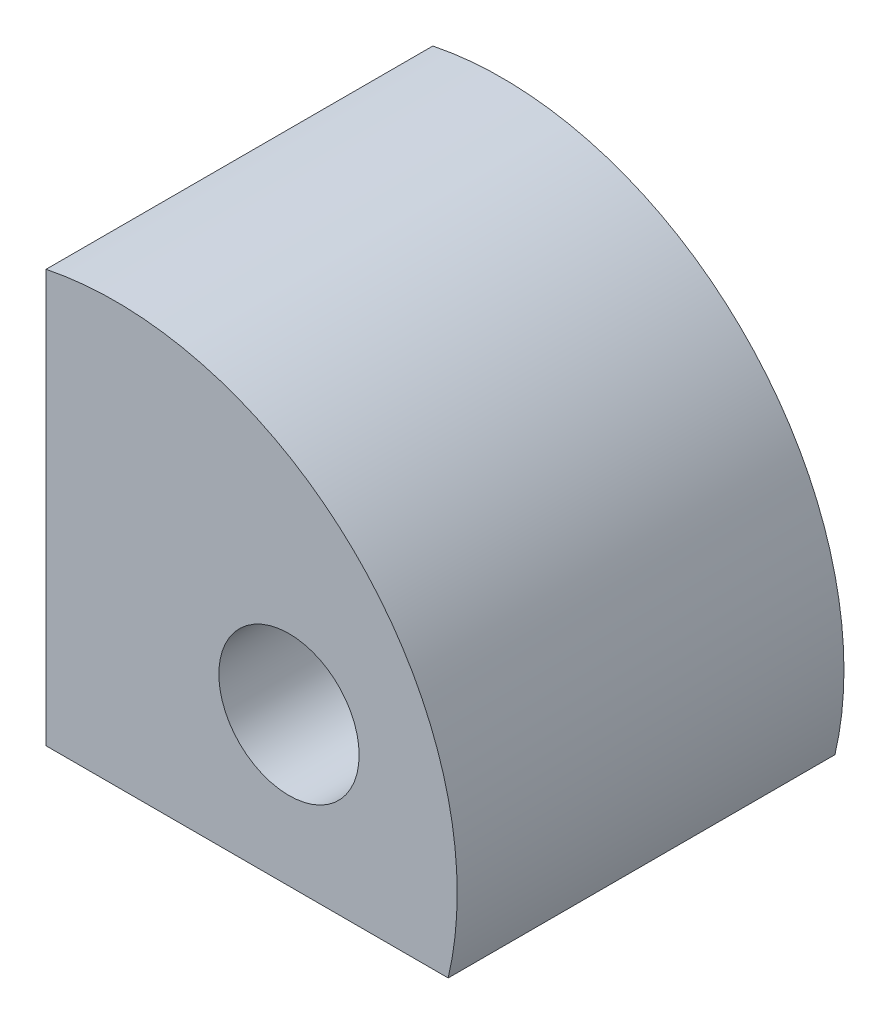
ISO-10303-21;
HEADER;
FILE_DESCRIPTION(('STEP AP214'),'2;1');
FILE_NAME('part.step','',(''),(''),'','','');
FILE_SCHEMA(('AUTOMOTIVE_DESIGN { 1 0 10303 214 1 1 1 1 }'));
ENDSEC;
DATA;
#1=APPLICATION_CONTEXT('core data for automotive mechanical design processes');
#2=APPLICATION_PROTOCOL_DEFINITION('international standard','automotive_design',2000,#1);
#3=PRODUCT_CONTEXT('',#1,'mechanical');
#4=PRODUCT('Part','Part','',(#3));
#5=PRODUCT_RELATED_PRODUCT_CATEGORY('part','',(#4));
#6=PRODUCT_DEFINITION_FORMATION('','',#4);
#7=PRODUCT_DEFINITION_CONTEXT('part definition',#1,'design');
#8=PRODUCT_DEFINITION('design','',#6,#7);
#9=PRODUCT_DEFINITION_SHAPE('','',#8);
#10=(LENGTH_UNIT() NAMED_UNIT(*) SI_UNIT(.MILLI.,.METRE.));
#11=(NAMED_UNIT(*) PLANE_ANGLE_UNIT() SI_UNIT($,.RADIAN.));
#12=(NAMED_UNIT(*) SI_UNIT($,.STERADIAN.) SOLID_ANGLE_UNIT());
#13=UNCERTAINTY_MEASURE_WITH_UNIT(LENGTH_MEASURE(1.E-05),#10,'distance_accuracy_value','');
#14=(GEOMETRIC_REPRESENTATION_CONTEXT(3) GLOBAL_UNCERTAINTY_ASSIGNED_CONTEXT((#13)) GLOBAL_UNIT_ASSIGNED_CONTEXT((#10,
#11,#12)) REPRESENTATION_CONTEXT('',''));
#15=CARTESIAN_POINT('',(0.,0.,0.));
#16=DIRECTION('',(0.,0.,1.));
#17=DIRECTION('',(1.,0.,0.));
#18=AXIS2_PLACEMENT_3D('',#15,#16,#17);
#19=CARTESIAN_POINT('',(-1.2151235167292,-2.86143504016257,9.37333333333333));
#20=DIRECTION('',(0.,0.,1.));
#21=DIRECTION('',(1.,0.,0.));
#22=AXIS2_PLACEMENT_3D('',#19,#20,#21);
#23=PLANE('',#22);
#24=CARTESIAN_POINT('',(-1.2151235167292,-2.86143504016257,9.37333333333333));
#25=DIRECTION('',(0.,0.,1.));
#26=DIRECTION('',(1.,0.,0.));
#27=AXIS2_PLACEMENT_3D('',#24,#25,#26);
#28=CIRCLE('',#27,8.28554143514574);
#29=CARTESIAN_POINT('',(6.85253507844266,-4.74904772958444,9.37333333333333));
#30=VERTEX_POINT('',#29);
#31=CARTESIAN_POINT('',(-2.89418707960662,5.25219191856151,9.37333333333333));
#32=VERTEX_POINT('',#31);
#33=EDGE_CURVE('E79',#30,#32,#28,.T.);
#34=ORIENTED_EDGE('',*,*,#33,.T.);
#35=DIRECTION('',(0.,-1.,0.));
#36=VECTOR('',#35,1.);
#37=CARTESIAN_POINT('',(-2.89418707960662,5.25219191856151,9.37333333333333));
#38=LINE('',#37,#36);
#39=CARTESIAN_POINT('',(-2.89418707960662,-4.74904772958444,9.37333333333333));
#40=VERTEX_POINT('',#39);
#41=EDGE_CURVE('E75',#32,#40,#38,.T.);
#42=ORIENTED_EDGE('',*,*,#41,.T.);
#43=DIRECTION('',(1.,0.,0.));
#44=VECTOR('',#43,1.);
#45=CARTESIAN_POINT('',(6.85253507844266,-4.74904772958444,9.37333333333333));
#46=LINE('',#45,#44);
#47=EDGE_CURVE('E55',#40,#30,#46,.T.);
#48=ORIENTED_EDGE('',*,*,#47,.T.);
#49=EDGE_LOOP('',(#34,#42,#48));
#50=FACE_BOUND('',#49,.T.);
#51=CARTESIAN_POINT('',(2.99372427545906,-1.14904772958444,9.37333333333333));
#52=DIRECTION('',(0.,0.,1.));
#53=DIRECTION('',(1.,0.,0.));
#54=AXIS2_PLACEMENT_3D('',#51,#52,#53);
#55=CIRCLE('',#54,1.7);
#56=CARTESIAN_POINT('',(4.69372427545906,-1.14904772958444,9.37333333333333));
#57=VERTEX_POINT('',#56);
#58=EDGE_CURVE('E89',#57,#57,#55,.T.);
#59=ORIENTED_EDGE('',*,*,#58,.F.);
#60=EDGE_LOOP('',(#59));
#61=FACE_BOUND('',#60,.T.);
#62=ADVANCED_FACE('F38',(#50,#61),#23,.T.);
#63=CARTESIAN_POINT('',(-1.2151235167292,-2.86143504016257,0.));
#64=DIRECTION('',(0.,0.,1.));
#65=DIRECTION('',(1.,0.,0.));
#66=AXIS2_PLACEMENT_3D('',#63,#64,#65);
#67=PLANE('',#66);
#68=CARTESIAN_POINT('',(-1.2151235167292,-2.86143504016257,0.));
#69=DIRECTION('',(0.,0.,1.));
#70=DIRECTION('',(1.,0.,0.));
#71=AXIS2_PLACEMENT_3D('',#68,#69,#70);
#72=CIRCLE('',#71,8.28554143514574);
#73=CARTESIAN_POINT('',(6.85253507844266,-4.74904772958444,0.));
#74=VERTEX_POINT('',#73);
#75=CARTESIAN_POINT('',(-2.89418707960662,5.25219191856151,0.));
#76=VERTEX_POINT('',#75);
#77=EDGE_CURVE('E86',#74,#76,#72,.T.);
#78=ORIENTED_EDGE('',*,*,#77,.F.);
#79=DIRECTION('',(1.,0.,0.));
#80=VECTOR('',#79,1.);
#81=CARTESIAN_POINT('',(6.85253507844266,-4.74904772958444,0.));
#82=LINE('',#81,#80);
#83=CARTESIAN_POINT('',(-2.89418707960662,-4.74904772958444,0.));
#84=VERTEX_POINT('',#83);
#85=EDGE_CURVE('E72',#84,#74,#82,.T.);
#86=ORIENTED_EDGE('',*,*,#85,.F.);
#87=DIRECTION('',(0.,-1.,0.));
#88=VECTOR('',#87,1.);
#89=CARTESIAN_POINT('',(-2.89418707960662,5.25219191856151,0.));
#90=LINE('',#89,#88);
#91=EDGE_CURVE('E67',#76,#84,#90,.T.);
#92=ORIENTED_EDGE('',*,*,#91,.F.);
#93=EDGE_LOOP('',(#78,#86,#92));
#94=FACE_BOUND('',#93,.T.);
#95=CARTESIAN_POINT('',(2.99372427545906,-1.14904772958444,0.));
#96=DIRECTION('',(0.,0.,1.));
#97=DIRECTION('',(1.,0.,0.));
#98=AXIS2_PLACEMENT_3D('',#95,#96,#97);
#99=CIRCLE('',#98,1.7);
#100=CARTESIAN_POINT('',(4.69372427545906,-1.14904772958444,0.));
#101=VERTEX_POINT('',#100);
#102=EDGE_CURVE('E93',#101,#101,#99,.T.);
#103=ORIENTED_EDGE('',*,*,#102,.T.);
#104=EDGE_LOOP('',(#103));
#105=FACE_BOUND('',#104,.T.);
#106=ADVANCED_FACE('F99',(#94,#105),#67,.F.);
#107=CARTESIAN_POINT('',(-1.2151235167292,-2.86143504016257,9.37333333333333));
#108=DIRECTION('',(0.,0.,-1.));
#109=DIRECTION('',(-1.,0.,0.));
#110=AXIS2_PLACEMENT_3D('',#107,#108,#109);
#111=CYLINDRICAL_SURFACE('',#110,8.28554143514574);
#112=ORIENTED_EDGE('',*,*,#77,.T.);
#113=DIRECTION('',(0.,0.,-1.));
#114=VECTOR('',#113,1.);
#115=CARTESIAN_POINT('',(-2.89418707960662,5.25219191856151,9.37333333333333));
#116=LINE('',#115,#114);
#117=EDGE_CURVE('E11',#32,#76,#116,.T.);
#118=ORIENTED_EDGE('',*,*,#117,.F.);
#119=ORIENTED_EDGE('',*,*,#33,.F.);
#120=DIRECTION('',(0.,0.,-1.));
#121=VECTOR('',#120,1.);
#122=CARTESIAN_POINT('',(6.85253507844266,-4.74904772958444,9.37333333333333));
#123=LINE('',#122,#121);
#124=EDGE_CURVE('E87',#30,#74,#123,.T.);
#125=ORIENTED_EDGE('',*,*,#124,.T.);
#126=EDGE_LOOP('',(#112,#118,#119,#125));
#127=FACE_BOUND('',#126,.T.);
#128=ADVANCED_FACE('F40',(#127),#111,.T.);
#129=CARTESIAN_POINT('',(-2.89418707960662,5.25219191856151,9.37333333333333));
#130=DIRECTION('',(1.,0.,0.));
#131=DIRECTION('',(0.,0.,-1.));
#132=AXIS2_PLACEMENT_3D('',#129,#130,#131);
#133=PLANE('',#132);
#134=ORIENTED_EDGE('',*,*,#91,.T.);
#135=DIRECTION('',(0.,0.,-1.));
#136=VECTOR('',#135,1.);
#137=CARTESIAN_POINT('',(-2.89418707960662,-4.74904772958444,9.37333333333333));
#138=LINE('',#137,#136);
#139=EDGE_CURVE('E47',#40,#84,#138,.T.);
#140=ORIENTED_EDGE('',*,*,#139,.F.);
#141=ORIENTED_EDGE('',*,*,#41,.F.);
#142=ORIENTED_EDGE('',*,*,#117,.T.);
#143=EDGE_LOOP('',(#134,#140,#141,#142));
#144=FACE_BOUND('',#143,.T.);
#145=ADVANCED_FACE('F76',(#144),#133,.F.);
#146=CARTESIAN_POINT('',(6.85253507844266,-4.74904772958444,9.37333333333333));
#147=DIRECTION('',(0.,1.,0.));
#148=DIRECTION('',(0.,0.,1.));
#149=AXIS2_PLACEMENT_3D('',#146,#147,#148);
#150=PLANE('',#149);
#151=ORIENTED_EDGE('',*,*,#85,.T.);
#152=ORIENTED_EDGE('',*,*,#124,.F.);
#153=ORIENTED_EDGE('',*,*,#47,.F.);
#154=ORIENTED_EDGE('',*,*,#139,.T.);
#155=EDGE_LOOP('',(#151,#152,#153,#154));
#156=FACE_BOUND('',#155,.T.);
#157=ADVANCED_FACE('F98',(#156),#150,.F.);
#158=CARTESIAN_POINT('',(2.99372427545906,-1.14904772958444,9.37333333333333));
#159=DIRECTION('',(0.,0.,-1.));
#160=DIRECTION('',(-1.,0.,0.));
#161=AXIS2_PLACEMENT_3D('',#158,#159,#160);
#162=CYLINDRICAL_SURFACE('',#161,1.7);
#163=ORIENTED_EDGE('',*,*,#58,.T.);
#164=EDGE_LOOP('',(#163));
#165=FACE_BOUND('',#164,.T.);
#166=ORIENTED_EDGE('',*,*,#102,.F.);
#167=EDGE_LOOP('',(#166));
#168=FACE_BOUND('',#167,.T.);
#169=ADVANCED_FACE('F107',(#165,#168),#162,.F.);
#170=CLOSED_SHELL('',(#62,#106,#128,#145,#157,#169));
#171=MANIFOLD_SOLID_BREP('B2',#170);
#172=ADVANCED_BREP_SHAPE_REPRESENTATION('',(#18,#171),#14);
#173=SHAPE_DEFINITION_REPRESENTATION(#9,#172);
ENDSEC;
END-ISO-10303-21;
